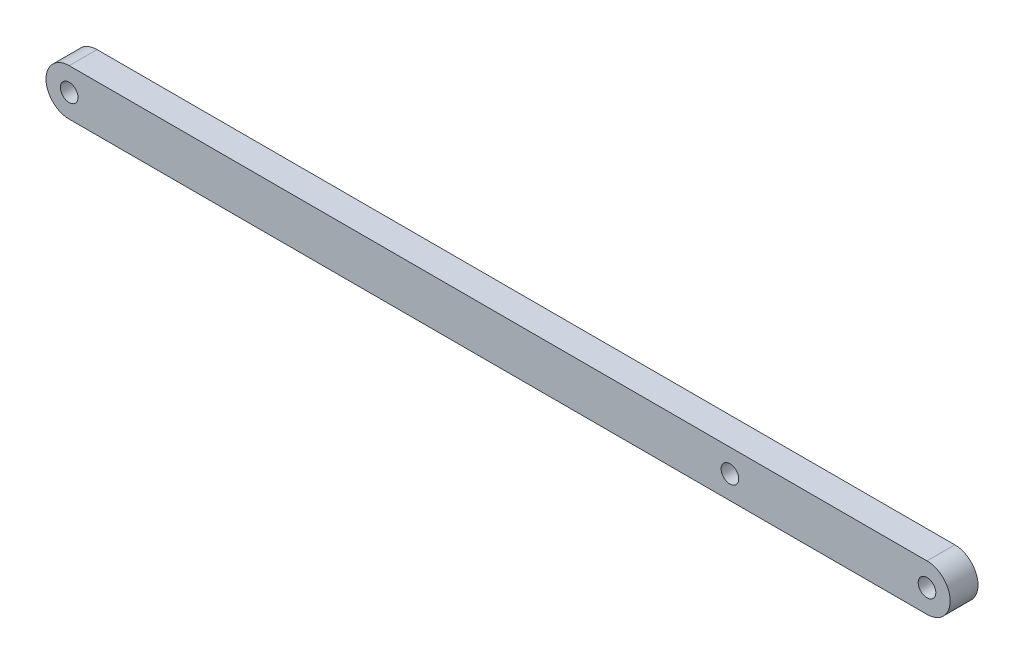
ISO-10303-21;
HEADER;
FILE_DESCRIPTION(('STEP AP214'),'2;1');
FILE_NAME('part.step','',(''),(''),'','','');
FILE_SCHEMA(('AUTOMOTIVE_DESIGN { 1 0 10303 214 1 1 1 1 }'));
ENDSEC;
DATA;
#1=APPLICATION_CONTEXT('core data for automotive mechanical design processes');
#2=APPLICATION_PROTOCOL_DEFINITION('international standard','automotive_design',2000,#1);
#3=PRODUCT_CONTEXT('',#1,'mechanical');
#4=PRODUCT('Part','Part','',(#3));
#5=PRODUCT_RELATED_PRODUCT_CATEGORY('part','',(#4));
#6=PRODUCT_DEFINITION_FORMATION('','',#4);
#7=PRODUCT_DEFINITION_CONTEXT('part definition',#1,'design');
#8=PRODUCT_DEFINITION('design','',#6,#7);
#9=PRODUCT_DEFINITION_SHAPE('','',#8);
#10=(LENGTH_UNIT() NAMED_UNIT(*) SI_UNIT(.MILLI.,.METRE.));
#11=(NAMED_UNIT(*) PLANE_ANGLE_UNIT() SI_UNIT($,.RADIAN.));
#12=(NAMED_UNIT(*) SI_UNIT($,.STERADIAN.) SOLID_ANGLE_UNIT());
#13=UNCERTAINTY_MEASURE_WITH_UNIT(LENGTH_MEASURE(1.E-05),#10,'distance_accuracy_value','');
#14=(GEOMETRIC_REPRESENTATION_CONTEXT(3) GLOBAL_UNCERTAINTY_ASSIGNED_CONTEXT((#13)) GLOBAL_UNIT_ASSIGNED_CONTEXT((#10,
#11,#12)) REPRESENTATION_CONTEXT('',''));
#15=CARTESIAN_POINT('',(0.,0.,0.));
#16=DIRECTION('',(0.,0.,1.));
#17=DIRECTION('',(1.,0.,0.));
#18=AXIS2_PLACEMENT_3D('',#15,#16,#17);
#19=CARTESIAN_POINT('',(92.5,0.,6.));
#20=DIRECTION('',(0.,0.,-1.));
#21=DIRECTION('',(-1.,0.,0.));
#22=AXIS2_PLACEMENT_3D('',#19,#20,#21);
#23=PLANE('',#22);
#24=CARTESIAN_POINT('',(92.5,0.,6.));
#25=DIRECTION('',(0.,0.,1.));
#26=DIRECTION('',(-1.,0.,0.));
#27=AXIS2_PLACEMENT_3D('',#24,#25,#26);
#28=CIRCLE('',#27,5.00000000000003);
#29=CARTESIAN_POINT('',(92.5,-5.00000000000003,6.));
#30=VERTEX_POINT('',#29);
#31=CARTESIAN_POINT('',(92.5,5.00000000000003,6.));
#32=VERTEX_POINT('',#31);
#33=EDGE_CURVE('E95',#30,#32,#28,.T.);
#34=ORIENTED_EDGE('',*,*,#33,.T.);
#35=DIRECTION('',(-1.,0.,0.));
#36=VECTOR('',#35,1.);
#37=CARTESIAN_POINT('',(-92.5,5.,6.));
#38=LINE('',#37,#36);
#39=CARTESIAN_POINT('',(-92.5,5.00000000000001,6.));
#40=VERTEX_POINT('',#39);
#41=EDGE_CURVE('E90',#32,#40,#38,.T.);
#42=ORIENTED_EDGE('',*,*,#41,.T.);
#43=CARTESIAN_POINT('',(-92.5,0.,6.));
#44=DIRECTION('',(0.,0.,1.));
#45=DIRECTION('',(1.,0.,0.));
#46=AXIS2_PLACEMENT_3D('',#43,#44,#45);
#47=CIRCLE('',#46,5.00000000000003);
#48=CARTESIAN_POINT('',(-92.5,-5.00000000000007,6.));
#49=VERTEX_POINT('',#48);
#50=EDGE_CURVE('E93',#40,#49,#47,.T.);
#51=ORIENTED_EDGE('',*,*,#50,.T.);
#52=DIRECTION('',(1.,0.,0.));
#53=VECTOR('',#52,1.);
#54=CARTESIAN_POINT('',(-92.5,-5.00000000000007,6.));
#55=LINE('',#54,#53);
#56=EDGE_CURVE('E60',#49,#30,#55,.T.);
#57=ORIENTED_EDGE('',*,*,#56,.T.);
#58=EDGE_LOOP('',(#34,#42,#51,#57));
#59=FACE_BOUND('',#58,.T.);
#60=CARTESIAN_POINT('',(-92.5,0.,6.));
#61=DIRECTION('',(0.,0.,1.));
#62=DIRECTION('',(1.,0.,0.));
#63=AXIS2_PLACEMENT_3D('',#60,#61,#62);
#64=CIRCLE('',#63,1.9);
#65=CARTESIAN_POINT('',(-90.6,0.,6.));
#66=VERTEX_POINT('',#65);
#67=EDGE_CURVE('E115',#66,#66,#64,.T.);
#68=ORIENTED_EDGE('',*,*,#67,.F.);
#69=EDGE_LOOP('',(#68));
#70=FACE_BOUND('',#69,.T.);
#71=CARTESIAN_POINT('',(92.5,0.,6.));
#72=DIRECTION('',(0.,0.,1.));
#73=DIRECTION('',(1.,0.,0.));
#74=AXIS2_PLACEMENT_3D('',#71,#72,#73);
#75=CIRCLE('',#74,1.9);
#76=CARTESIAN_POINT('',(94.4,0.,6.));
#77=VERTEX_POINT('',#76);
#78=EDGE_CURVE('E137',#77,#77,#75,.T.);
#79=ORIENTED_EDGE('',*,*,#78,.F.);
#80=EDGE_LOOP('',(#79));
#81=FACE_BOUND('',#80,.T.);
#82=CARTESIAN_POINT('',(50.,0.,6.));
#83=DIRECTION('',(0.,0.,1.));
#84=DIRECTION('',(1.,0.,0.));
#85=AXIS2_PLACEMENT_3D('',#82,#83,#84);
#86=CIRCLE('',#85,1.9);
#87=CARTESIAN_POINT('',(51.9,0.,6.));
#88=VERTEX_POINT('',#87);
#89=EDGE_CURVE('E145',#88,#88,#86,.T.);
#90=ORIENTED_EDGE('',*,*,#89,.F.);
#91=EDGE_LOOP('',(#90));
#92=FACE_BOUND('',#91,.T.);
#93=ADVANCED_FACE('F42',(#59,#70,#81,#92),#23,.F.);
#94=CARTESIAN_POINT('',(92.5,0.,0.));
#95=DIRECTION('',(0.,0.,-1.));
#96=DIRECTION('',(-1.,0.,0.));
#97=AXIS2_PLACEMENT_3D('',#94,#95,#96);
#98=PLANE('',#97);
#99=CARTESIAN_POINT('',(92.5,0.,0.));
#100=DIRECTION('',(0.,0.,1.));
#101=DIRECTION('',(1.,0.,0.));
#102=AXIS2_PLACEMENT_3D('',#99,#100,#101);
#103=CIRCLE('',#102,1.9);
#104=CARTESIAN_POINT('',(94.4,0.,0.));
#105=VERTEX_POINT('',#104);
#106=EDGE_CURVE('E141',#105,#105,#103,.T.);
#107=ORIENTED_EDGE('',*,*,#106,.T.);
#108=EDGE_LOOP('',(#107));
#109=FACE_BOUND('',#108,.T.);
#110=CARTESIAN_POINT('',(92.5,0.,0.));
#111=DIRECTION('',(0.,0.,1.));
#112=DIRECTION('',(-1.,0.,0.));
#113=AXIS2_PLACEMENT_3D('',#110,#111,#112);
#114=CIRCLE('',#113,5.00000000000003);
#115=CARTESIAN_POINT('',(92.5,-5.00000000000003,0.));
#116=VERTEX_POINT('',#115);
#117=CARTESIAN_POINT('',(92.5,5.00000000000003,0.));
#118=VERTEX_POINT('',#117);
#119=EDGE_CURVE('E111',#116,#118,#114,.T.);
#120=ORIENTED_EDGE('',*,*,#119,.F.);
#121=DIRECTION('',(1.,0.,0.));
#122=VECTOR('',#121,1.);
#123=CARTESIAN_POINT('',(-92.5,-5.00000000000007,0.));
#124=LINE('',#123,#122);
#125=CARTESIAN_POINT('',(-92.5,-5.00000000000007,0.));
#126=VERTEX_POINT('',#125);
#127=EDGE_CURVE('E83',#126,#116,#124,.T.);
#128=ORIENTED_EDGE('',*,*,#127,.F.);
#129=CARTESIAN_POINT('',(-92.5,0.,0.));
#130=DIRECTION('',(0.,0.,1.));
#131=DIRECTION('',(1.,0.,0.));
#132=AXIS2_PLACEMENT_3D('',#129,#130,#131);
#133=CIRCLE('',#132,5.00000000000003);
#134=CARTESIAN_POINT('',(-92.5,5.00000000000001,0.));
#135=VERTEX_POINT('',#134);
#136=EDGE_CURVE('E77',#135,#126,#133,.T.);
#137=ORIENTED_EDGE('',*,*,#136,.F.);
#138=DIRECTION('',(-1.,0.,0.));
#139=VECTOR('',#138,1.);
#140=CARTESIAN_POINT('',(-92.5,5.,0.));
#141=LINE('',#140,#139);
#142=EDGE_CURVE('E100',#118,#135,#141,.T.);
#143=ORIENTED_EDGE('',*,*,#142,.F.);
#144=EDGE_LOOP('',(#120,#128,#137,#143));
#145=FACE_BOUND('',#144,.T.);
#146=CARTESIAN_POINT('',(-92.5,0.,0.));
#147=DIRECTION('',(0.,0.,1.));
#148=DIRECTION('',(1.,0.,0.));
#149=AXIS2_PLACEMENT_3D('',#146,#147,#148);
#150=CIRCLE('',#149,1.9);
#151=CARTESIAN_POINT('',(-90.6,0.,0.));
#152=VERTEX_POINT('',#151);
#153=EDGE_CURVE('E133',#152,#152,#150,.T.);
#154=ORIENTED_EDGE('',*,*,#153,.T.);
#155=EDGE_LOOP('',(#154));
#156=FACE_BOUND('',#155,.T.);
#157=CARTESIAN_POINT('',(50.,0.,0.));
#158=DIRECTION('',(0.,0.,1.));
#159=DIRECTION('',(1.,0.,0.));
#160=AXIS2_PLACEMENT_3D('',#157,#158,#159);
#161=CIRCLE('',#160,1.9);
#162=CARTESIAN_POINT('',(51.9,0.,0.));
#163=VERTEX_POINT('',#162);
#164=EDGE_CURVE('E149',#163,#163,#161,.T.);
#165=ORIENTED_EDGE('',*,*,#164,.T.);
#166=EDGE_LOOP('',(#165));
#167=FACE_BOUND('',#166,.T.);
#168=ADVANCED_FACE('F128',(#109,#145,#156,#167),#98,.T.);
#169=CARTESIAN_POINT('',(92.5,0.,6.));
#170=DIRECTION('',(0.,0.,-1.));
#171=DIRECTION('',(-1.,0.,0.));
#172=AXIS2_PLACEMENT_3D('',#169,#170,#171);
#173=CYLINDRICAL_SURFACE('',#172,5.00000000000003);
#174=ORIENTED_EDGE('',*,*,#119,.T.);
#175=DIRECTION('',(0.,0.,-1.));
#176=VECTOR('',#175,1.);
#177=CARTESIAN_POINT('',(92.5,5.00000000000003,6.));
#178=LINE('',#177,#176);
#179=EDGE_CURVE('E11',#32,#118,#178,.T.);
#180=ORIENTED_EDGE('',*,*,#179,.F.);
#181=ORIENTED_EDGE('',*,*,#33,.F.);
#182=DIRECTION('',(0.,0.,-1.));
#183=VECTOR('',#182,1.);
#184=CARTESIAN_POINT('',(92.5,-5.00000000000003,6.));
#185=LINE('',#184,#183);
#186=EDGE_CURVE('E107',#30,#116,#185,.T.);
#187=ORIENTED_EDGE('',*,*,#186,.T.);
#188=EDGE_LOOP('',(#174,#180,#181,#187));
#189=FACE_BOUND('',#188,.T.);
#190=ADVANCED_FACE('F44',(#189),#173,.T.);
#191=CARTESIAN_POINT('',(-92.5,5.,6.));
#192=DIRECTION('',(0.,-1.,0.));
#193=DIRECTION('',(1.,0.,0.));
#194=AXIS2_PLACEMENT_3D('',#191,#192,#193);
#195=PLANE('',#194);
#196=ORIENTED_EDGE('',*,*,#142,.T.);
#197=DIRECTION('',(0.,0.,-1.));
#198=VECTOR('',#197,1.);
#199=CARTESIAN_POINT('',(-92.5,5.00000000000001,6.));
#200=LINE('',#199,#198);
#201=EDGE_CURVE('E52',#40,#135,#200,.T.);
#202=ORIENTED_EDGE('',*,*,#201,.F.);
#203=ORIENTED_EDGE('',*,*,#41,.F.);
#204=ORIENTED_EDGE('',*,*,#179,.T.);
#205=EDGE_LOOP('',(#196,#202,#203,#204));
#206=FACE_BOUND('',#205,.T.);
#207=ADVANCED_FACE('F99',(#206),#195,.F.);
#208=CARTESIAN_POINT('',(-92.5,0.,6.));
#209=DIRECTION('',(0.,0.,-1.));
#210=DIRECTION('',(-1.,0.,0.));
#211=AXIS2_PLACEMENT_3D('',#208,#209,#210);
#212=CYLINDRICAL_SURFACE('',#211,5.00000000000003);
#213=ORIENTED_EDGE('',*,*,#136,.T.);
#214=DIRECTION('',(0.,0.,-1.));
#215=VECTOR('',#214,1.);
#216=CARTESIAN_POINT('',(-92.5,-5.00000000000007,6.));
#217=LINE('',#216,#215);
#218=EDGE_CURVE('E102',#49,#126,#217,.T.);
#219=ORIENTED_EDGE('',*,*,#218,.F.);
#220=ORIENTED_EDGE('',*,*,#50,.F.);
#221=ORIENTED_EDGE('',*,*,#201,.T.);
#222=EDGE_LOOP('',(#213,#219,#220,#221));
#223=FACE_BOUND('',#222,.T.);
#224=ADVANCED_FACE('F103',(#223),#212,.T.);
#225=CARTESIAN_POINT('',(-92.5,-5.00000000000007,6.));
#226=DIRECTION('',(0.,1.,0.));
#227=DIRECTION('',(-1.,0.,0.));
#228=AXIS2_PLACEMENT_3D('',#225,#226,#227);
#229=PLANE('',#228);
#230=ORIENTED_EDGE('',*,*,#127,.T.);
#231=ORIENTED_EDGE('',*,*,#186,.F.);
#232=ORIENTED_EDGE('',*,*,#56,.F.);
#233=ORIENTED_EDGE('',*,*,#218,.T.);
#234=EDGE_LOOP('',(#230,#231,#232,#233));
#235=FACE_BOUND('',#234,.T.);
#236=ADVANCED_FACE('F125',(#235),#229,.F.);
#237=CARTESIAN_POINT('',(-92.5,0.,6.));
#238=DIRECTION('',(0.,0.,-1.));
#239=DIRECTION('',(-1.,0.,0.));
#240=AXIS2_PLACEMENT_3D('',#237,#238,#239);
#241=CYLINDRICAL_SURFACE('',#240,1.9);
#242=ORIENTED_EDGE('',*,*,#67,.T.);
#243=EDGE_LOOP('',(#242));
#244=FACE_BOUND('',#243,.T.);
#245=ORIENTED_EDGE('',*,*,#153,.F.);
#246=EDGE_LOOP('',(#245));
#247=FACE_BOUND('',#246,.T.);
#248=ADVANCED_FACE('F168',(#244,#247),#241,.F.);
#249=CARTESIAN_POINT('',(92.5,0.,6.));
#250=DIRECTION('',(0.,0.,-1.));
#251=DIRECTION('',(-1.,0.,0.));
#252=AXIS2_PLACEMENT_3D('',#249,#250,#251);
#253=CYLINDRICAL_SURFACE('',#252,1.9);
#254=ORIENTED_EDGE('',*,*,#78,.T.);
#255=EDGE_LOOP('',(#254));
#256=FACE_BOUND('',#255,.T.);
#257=ORIENTED_EDGE('',*,*,#106,.F.);
#258=EDGE_LOOP('',(#257));
#259=FACE_BOUND('',#258,.T.);
#260=ADVANCED_FACE('F222',(#256,#259),#253,.F.);
#261=CARTESIAN_POINT('',(50.,0.,6.));
#262=DIRECTION('',(0.,0.,-1.));
#263=DIRECTION('',(-1.,0.,0.));
#264=AXIS2_PLACEMENT_3D('',#261,#262,#263);
#265=CYLINDRICAL_SURFACE('',#264,1.9);
#266=ORIENTED_EDGE('',*,*,#89,.T.);
#267=EDGE_LOOP('',(#266));
#268=FACE_BOUND('',#267,.T.);
#269=ORIENTED_EDGE('',*,*,#164,.F.);
#270=EDGE_LOOP('',(#269));
#271=FACE_BOUND('',#270,.T.);
#272=ADVANCED_FACE('F157',(#268,#271),#265,.F.);
#273=CLOSED_SHELL('',(#93,#168,#190,#207,#224,#236,#248,#260,#272));
#274=MANIFOLD_SOLID_BREP('B2',#273);
#275=ADVANCED_BREP_SHAPE_REPRESENTATION('',(#18,#274),#14);
#276=SHAPE_DEFINITION_REPRESENTATION(#9,#275);
ENDSEC;
END-ISO-10303-21;
